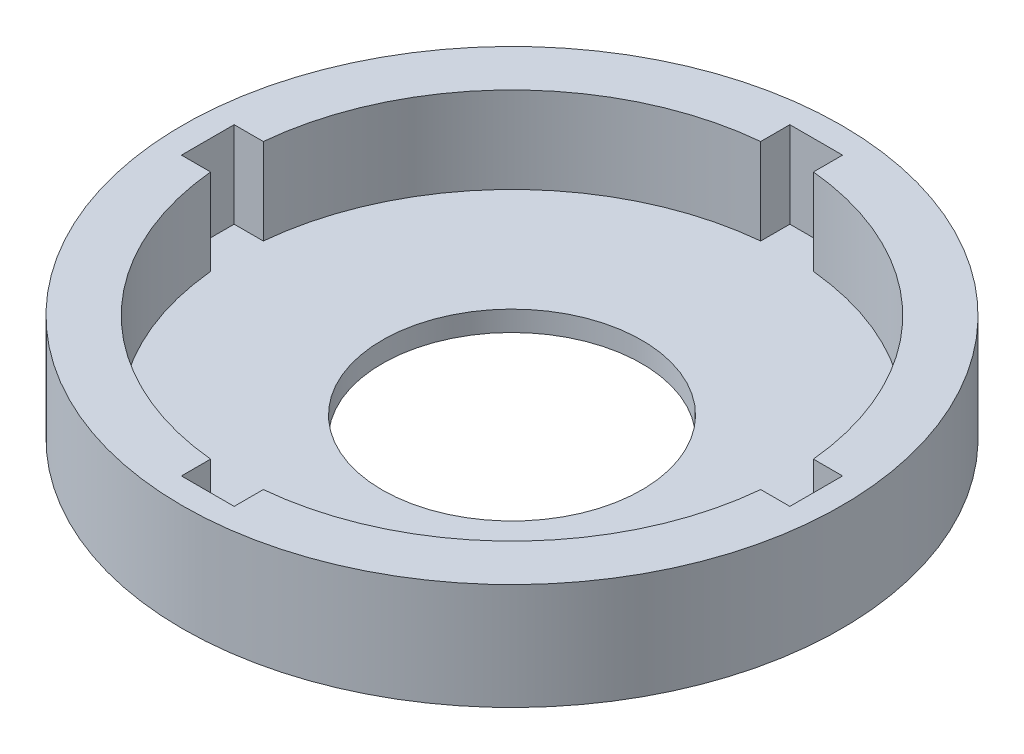
ISO-10303-21;
HEADER;
FILE_DESCRIPTION(('STEP AP214'),'2;1');
FILE_NAME('part.step','',(''),(''),'','','');
FILE_SCHEMA(('AUTOMOTIVE_DESIGN { 1 0 10303 214 1 1 1 1 }'));
ENDSEC;
DATA;
#1=APPLICATION_CONTEXT('core data for automotive mechanical design processes');
#2=APPLICATION_PROTOCOL_DEFINITION('international standard','automotive_design',2000,#1);
#3=PRODUCT_CONTEXT('',#1,'mechanical');
#4=PRODUCT('Part','Part','',(#3));
#5=PRODUCT_RELATED_PRODUCT_CATEGORY('part','',(#4));
#6=PRODUCT_DEFINITION_FORMATION('','',#4);
#7=PRODUCT_DEFINITION_CONTEXT('part definition',#1,'design');
#8=PRODUCT_DEFINITION('design','',#6,#7);
#9=PRODUCT_DEFINITION_SHAPE('','',#8);
#10=(LENGTH_UNIT() NAMED_UNIT(*) SI_UNIT(.MILLI.,.METRE.));
#11=(NAMED_UNIT(*) PLANE_ANGLE_UNIT() SI_UNIT($,.RADIAN.));
#12=(NAMED_UNIT(*) SI_UNIT($,.STERADIAN.) SOLID_ANGLE_UNIT());
#13=UNCERTAINTY_MEASURE_WITH_UNIT(LENGTH_MEASURE(1.E-05),#10,'distance_accuracy_value','');
#14=(GEOMETRIC_REPRESENTATION_CONTEXT(3) GLOBAL_UNCERTAINTY_ASSIGNED_CONTEXT((#13)) GLOBAL_UNIT_ASSIGNED_CONTEXT((#10,
#11,#12)) REPRESENTATION_CONTEXT('',''));
#15=CARTESIAN_POINT('',(0.,0.,0.));
#16=DIRECTION('',(0.,0.,1.));
#17=DIRECTION('',(1.,0.,0.));
#18=AXIS2_PLACEMENT_3D('',#15,#16,#17);
#19=CARTESIAN_POINT('',(0.,2.,0.));
#20=DIRECTION('',(0.,1.,0.));
#21=DIRECTION('',(0.,0.,1.));
#22=AXIS2_PLACEMENT_3D('',#19,#20,#21);
#23=PLANE('',#22);
#24=CARTESIAN_POINT('',(0.,2.,0.));
#25=DIRECTION('',(0.,1.,0.));
#26=DIRECTION('',(0.,0.,1.));
#27=AXIS2_PLACEMENT_3D('',#24,#25,#26);
#28=CIRCLE('',#27,27.25);
#29=CARTESIAN_POINT('',(2.6,2.,27.1256797149859));
#30=VERTEX_POINT('',#29);
#31=CARTESIAN_POINT('',(27.1256797149859,2.,2.59999999999999));
#32=VERTEX_POINT('',#31);
#33=EDGE_CURVE('E199',#30,#32,#28,.T.);
#34=ORIENTED_EDGE('',*,*,#33,.T.);
#35=DIRECTION('',(-1.,0.,0.));
#36=VECTOR('',#35,1.);
#37=CARTESIAN_POINT('',(0.,2.,2.6));
#38=LINE('',#37,#36);
#39=CARTESIAN_POINT('',(30.,2.,2.59999999999999));
#40=VERTEX_POINT('',#39);
#41=EDGE_CURVE('E244',#40,#32,#38,.T.);
#42=ORIENTED_EDGE('',*,*,#41,.F.);
#43=DIRECTION('',(0.,0.,1.));
#44=VECTOR('',#43,1.);
#45=CARTESIAN_POINT('',(30.,2.,0.));
#46=LINE('',#45,#44);
#47=CARTESIAN_POINT('',(30.,2.,-2.60000000000001));
#48=VERTEX_POINT('',#47);
#49=EDGE_CURVE('E241',#48,#40,#46,.T.);
#50=ORIENTED_EDGE('',*,*,#49,.F.);
#51=DIRECTION('',(-1.,0.,0.));
#52=VECTOR('',#51,1.);
#53=CARTESIAN_POINT('',(0.,2.,-2.6));
#54=LINE('',#53,#52);
#55=CARTESIAN_POINT('',(27.1256797149859,2.,-2.60000000000001));
#56=VERTEX_POINT('',#55);
#57=EDGE_CURVE('E168',#48,#56,#54,.T.);
#58=ORIENTED_EDGE('',*,*,#57,.T.);
#59=CARTESIAN_POINT('',(2.60000000000001,2.,-27.1256797149859));
#60=VERTEX_POINT('',#59);
#61=EDGE_CURVE('E204',#56,#60,#28,.T.);
#62=ORIENTED_EDGE('',*,*,#61,.T.);
#63=DIRECTION('',(0.,0.,1.));
#64=VECTOR('',#63,1.);
#65=CARTESIAN_POINT('',(2.60000000000001,2.,0.));
#66=LINE('',#65,#64);
#67=CARTESIAN_POINT('',(2.60000000000001,2.,-30.));
#68=VERTEX_POINT('',#67);
#69=EDGE_CURVE('E235',#68,#60,#66,.T.);
#70=ORIENTED_EDGE('',*,*,#69,.F.);
#71=DIRECTION('',(1.,0.,0.));
#72=VECTOR('',#71,1.);
#73=CARTESIAN_POINT('',(0.,2.,-30.));
#74=LINE('',#73,#72);
#75=CARTESIAN_POINT('',(-2.59999999999999,2.,-30.));
#76=VERTEX_POINT('',#75);
#77=EDGE_CURVE('E232',#76,#68,#74,.T.);
#78=ORIENTED_EDGE('',*,*,#77,.F.);
#79=DIRECTION('',(0.,0.,1.));
#80=VECTOR('',#79,1.);
#81=CARTESIAN_POINT('',(-2.59999999999999,2.,0.));
#82=LINE('',#81,#80);
#83=CARTESIAN_POINT('',(-2.59999999999999,2.,-27.1256797149859));
#84=VERTEX_POINT('',#83);
#85=EDGE_CURVE('E228',#76,#84,#82,.T.);
#86=ORIENTED_EDGE('',*,*,#85,.T.);
#87=CARTESIAN_POINT('',(-27.1256797149859,2.,-2.60000000000002));
#88=VERTEX_POINT('',#87);
#89=EDGE_CURVE('E227',#84,#88,#28,.T.);
#90=ORIENTED_EDGE('',*,*,#89,.T.);
#91=DIRECTION('',(1.,0.,0.));
#92=VECTOR('',#91,1.);
#93=CARTESIAN_POINT('',(0.,2.,-2.60000000000002));
#94=LINE('',#93,#92);
#95=CARTESIAN_POINT('',(-30.,2.,-2.60000000000002));
#96=VERTEX_POINT('',#95);
#97=EDGE_CURVE('E223',#96,#88,#94,.T.);
#98=ORIENTED_EDGE('',*,*,#97,.F.);
#99=DIRECTION('',(0.,0.,-1.));
#100=VECTOR('',#99,1.);
#101=CARTESIAN_POINT('',(-30.,2.,0.));
#102=LINE('',#101,#100);
#103=CARTESIAN_POINT('',(-30.,2.,2.59999999999998));
#104=VERTEX_POINT('',#103);
#105=EDGE_CURVE('E220',#104,#96,#102,.T.);
#106=ORIENTED_EDGE('',*,*,#105,.F.);
#107=DIRECTION('',(1.,0.,0.));
#108=VECTOR('',#107,1.);
#109=CARTESIAN_POINT('',(0.,2.,2.59999999999998));
#110=LINE('',#109,#108);
#111=CARTESIAN_POINT('',(-27.1256797149859,2.,2.59999999999998));
#112=VERTEX_POINT('',#111);
#113=EDGE_CURVE('E216',#104,#112,#110,.T.);
#114=ORIENTED_EDGE('',*,*,#113,.T.);
#115=CARTESIAN_POINT('',(-2.6,2.,27.1256797149859));
#116=VERTEX_POINT('',#115);
#117=EDGE_CURVE('E205',#112,#116,#28,.T.);
#118=ORIENTED_EDGE('',*,*,#117,.T.);
#119=DIRECTION('',(0.,0.,-1.));
#120=VECTOR('',#119,1.);
#121=CARTESIAN_POINT('',(-2.6,2.,0.));
#122=LINE('',#121,#120);
#123=CARTESIAN_POINT('',(-2.6,2.,30.));
#124=VERTEX_POINT('',#123);
#125=EDGE_CURVE('E212',#124,#116,#122,.T.);
#126=ORIENTED_EDGE('',*,*,#125,.F.);
#127=DIRECTION('',(-1.,0.,0.));
#128=VECTOR('',#127,1.);
#129=CARTESIAN_POINT('',(0.,2.,30.));
#130=LINE('',#129,#128);
#131=CARTESIAN_POINT('',(2.6,2.,30.));
#132=VERTEX_POINT('',#131);
#133=EDGE_CURVE('E209',#132,#124,#130,.T.);
#134=ORIENTED_EDGE('',*,*,#133,.F.);
#135=DIRECTION('',(0.,0.,-1.));
#136=VECTOR('',#135,1.);
#137=CARTESIAN_POINT('',(2.6,2.,0.));
#138=LINE('',#137,#136);
#139=EDGE_CURVE('E203',#132,#30,#138,.T.);
#140=ORIENTED_EDGE('',*,*,#139,.T.);
#141=EDGE_LOOP('',(#34,#42,#50,#58,#62,#70,#78,#86,#90,#98,#106,#114,#118,#126,#134,#140));
#142=FACE_BOUND('',#141,.T.);
#143=CARTESIAN_POINT('',(0.,2.,0.));
#144=DIRECTION('',(0.,1.,0.));
#145=DIRECTION('',(0.,0.,1.));
#146=AXIS2_PLACEMENT_3D('',#143,#144,#145);
#147=CIRCLE('',#146,12.8);
#148=CARTESIAN_POINT('',(0.,2.,12.8));
#149=VERTEX_POINT('',#148);
#150=EDGE_CURVE('E50',#149,#149,#147,.T.);
#151=ORIENTED_EDGE('',*,*,#150,.F.);
#152=EDGE_LOOP('',(#151));
#153=FACE_BOUND('',#152,.T.);
#154=ADVANCED_FACE('F41',(#142,#153),#23,.T.);
#155=CARTESIAN_POINT('',(0.,0.,0.));
#156=DIRECTION('',(0.,1.,0.));
#157=DIRECTION('',(0.,0.,1.));
#158=AXIS2_PLACEMENT_3D('',#155,#156,#157);
#159=PLANE('',#158);
#160=CARTESIAN_POINT('',(0.,0.,0.));
#161=DIRECTION('',(0.,1.,0.));
#162=DIRECTION('',(0.,0.,1.));
#163=AXIS2_PLACEMENT_3D('',#160,#161,#162);
#164=CIRCLE('',#163,32.5);
#165=CARTESIAN_POINT('',(0.,0.,32.5));
#166=VERTEX_POINT('',#165);
#167=EDGE_CURVE('E11',#166,#166,#164,.T.);
#168=ORIENTED_EDGE('',*,*,#167,.F.);
#169=EDGE_LOOP('',(#168));
#170=FACE_BOUND('',#169,.T.);
#171=CARTESIAN_POINT('',(0.,0.,0.));
#172=DIRECTION('',(0.,1.,0.));
#173=DIRECTION('',(0.,0.,1.));
#174=AXIS2_PLACEMENT_3D('',#171,#172,#173);
#175=CIRCLE('',#174,12.8);
#176=CARTESIAN_POINT('',(0.,0.,12.8));
#177=VERTEX_POINT('',#176);
#178=EDGE_CURVE('E291',#177,#177,#175,.T.);
#179=ORIENTED_EDGE('',*,*,#178,.T.);
#180=EDGE_LOOP('',(#179));
#181=FACE_BOUND('',#180,.T.);
#182=ADVANCED_FACE('F298',(#170,#181),#159,.F.);
#183=CARTESIAN_POINT('',(0.,2.,0.));
#184=DIRECTION('',(0.,-1.,0.));
#185=DIRECTION('',(0.,0.,-1.));
#186=AXIS2_PLACEMENT_3D('',#183,#184,#185);
#187=CYLINDRICAL_SURFACE('',#186,32.5);
#188=ORIENTED_EDGE('',*,*,#167,.T.);
#189=EDGE_LOOP('',(#188));
#190=FACE_BOUND('',#189,.T.);
#191=CARTESIAN_POINT('',(0.,10.5,0.));
#192=DIRECTION('',(0.,1.,0.));
#193=DIRECTION('',(0.,0.,1.));
#194=AXIS2_PLACEMENT_3D('',#191,#192,#193);
#195=CIRCLE('',#194,32.5);
#196=CARTESIAN_POINT('',(0.,10.5,32.5));
#197=VERTEX_POINT('',#196);
#198=EDGE_CURVE('E195',#197,#197,#195,.T.);
#199=ORIENTED_EDGE('',*,*,#198,.F.);
#200=EDGE_LOOP('',(#199));
#201=FACE_BOUND('',#200,.T.);
#202=ADVANCED_FACE('F43',(#190,#201),#187,.T.);
#203=CARTESIAN_POINT('',(0.,2.,0.));
#204=DIRECTION('',(0.,-1.,0.));
#205=DIRECTION('',(0.,0.,-1.));
#206=AXIS2_PLACEMENT_3D('',#203,#204,#205);
#207=CYLINDRICAL_SURFACE('',#206,12.8);
#208=ORIENTED_EDGE('',*,*,#150,.T.);
#209=EDGE_LOOP('',(#208));
#210=FACE_BOUND('',#209,.T.);
#211=ORIENTED_EDGE('',*,*,#178,.F.);
#212=EDGE_LOOP('',(#211));
#213=FACE_BOUND('',#212,.T.);
#214=ADVANCED_FACE('F300',(#210,#213),#207,.F.);
#215=CARTESIAN_POINT('',(0.,10.5,0.));
#216=DIRECTION('',(0.,-1.,0.));
#217=DIRECTION('',(0.,0.,-1.));
#218=AXIS2_PLACEMENT_3D('',#215,#216,#217);
#219=CYLINDRICAL_SURFACE('',#218,27.25);
#220=ORIENTED_EDGE('',*,*,#33,.F.);
#221=DIRECTION('',(0.,-1.,0.));
#222=VECTOR('',#221,1.);
#223=CARTESIAN_POINT('',(2.6,10.5,27.1256797149859));
#224=LINE('',#223,#222);
#225=CARTESIAN_POINT('',(2.6,10.5,27.1256797149859));
#226=VERTEX_POINT('',#225);
#227=EDGE_CURVE('E122',#226,#30,#224,.T.);
#228=ORIENTED_EDGE('',*,*,#227,.F.);
#229=CARTESIAN_POINT('',(0.,10.5,0.));
#230=DIRECTION('',(0.,1.,0.));
#231=DIRECTION('',(0.,0.,1.));
#232=AXIS2_PLACEMENT_3D('',#229,#230,#231);
#233=CIRCLE('',#232,27.25);
#234=CARTESIAN_POINT('',(27.1256797149859,10.5,2.59999999999999));
#235=VERTEX_POINT('',#234);
#236=EDGE_CURVE('E189',#226,#235,#233,.T.);
#237=ORIENTED_EDGE('',*,*,#236,.T.);
#238=DIRECTION('',(0.,-1.,0.));
#239=VECTOR('',#238,1.);
#240=CARTESIAN_POINT('',(27.1256797149859,10.5,2.59999999999999));
#241=LINE('',#240,#239);
#242=EDGE_CURVE('E118',#235,#32,#241,.T.);
#243=ORIENTED_EDGE('',*,*,#242,.T.);
#244=EDGE_LOOP('',(#220,#228,#237,#243));
#245=FACE_BOUND('',#244,.T.);
#246=ADVANCED_FACE('F302',(#245),#219,.F.);
#247=CARTESIAN_POINT('',(2.6,10.5,0.));
#248=DIRECTION('',(-1.,0.,0.));
#249=DIRECTION('',(0.,0.,1.));
#250=AXIS2_PLACEMENT_3D('',#247,#248,#249);
#251=PLANE('',#250);
#252=ORIENTED_EDGE('',*,*,#139,.F.);
#253=DIRECTION('',(0.,-1.,0.));
#254=VECTOR('',#253,1.);
#255=CARTESIAN_POINT('',(2.6,10.5,30.));
#256=LINE('',#255,#254);
#257=CARTESIAN_POINT('',(2.6,10.5,30.));
#258=VERTEX_POINT('',#257);
#259=EDGE_CURVE('E286',#258,#132,#256,.T.);
#260=ORIENTED_EDGE('',*,*,#259,.F.);
#261=DIRECTION('',(0.,0.,-1.));
#262=VECTOR('',#261,1.);
#263=CARTESIAN_POINT('',(2.6,10.5,0.));
#264=LINE('',#263,#262);
#265=EDGE_CURVE('E332',#258,#226,#264,.T.);
#266=ORIENTED_EDGE('',*,*,#265,.T.);
#267=ORIENTED_EDGE('',*,*,#227,.T.);
#268=EDGE_LOOP('',(#252,#260,#266,#267));
#269=FACE_BOUND('',#268,.T.);
#270=ADVANCED_FACE('F309',(#269),#251,.T.);
#271=CARTESIAN_POINT('',(0.,10.5,30.));
#272=DIRECTION('',(0.,0.,1.));
#273=DIRECTION('',(1.,0.,0.));
#274=AXIS2_PLACEMENT_3D('',#271,#272,#273);
#275=PLANE('',#274);
#276=ORIENTED_EDGE('',*,*,#133,.T.);
#277=DIRECTION('',(0.,-1.,0.));
#278=VECTOR('',#277,1.);
#279=CARTESIAN_POINT('',(-2.6,10.5,30.));
#280=LINE('',#279,#278);
#281=CARTESIAN_POINT('',(-2.6,10.5,30.));
#282=VERTEX_POINT('',#281);
#283=EDGE_CURVE('E282',#282,#124,#280,.T.);
#284=ORIENTED_EDGE('',*,*,#283,.F.);
#285=DIRECTION('',(-1.,0.,0.));
#286=VECTOR('',#285,1.);
#287=CARTESIAN_POINT('',(0.,10.5,30.));
#288=LINE('',#287,#286);
#289=EDGE_CURVE('E334',#258,#282,#288,.T.);
#290=ORIENTED_EDGE('',*,*,#289,.F.);
#291=ORIENTED_EDGE('',*,*,#259,.T.);
#292=EDGE_LOOP('',(#276,#284,#290,#291));
#293=FACE_BOUND('',#292,.T.);
#294=ADVANCED_FACE('F390',(#293),#275,.F.);
#295=CARTESIAN_POINT('',(-2.6,10.5,0.));
#296=DIRECTION('',(-1.,0.,0.));
#297=DIRECTION('',(0.,0.,1.));
#298=AXIS2_PLACEMENT_3D('',#295,#296,#297);
#299=PLANE('',#298);
#300=ORIENTED_EDGE('',*,*,#125,.T.);
#301=DIRECTION('',(0.,-1.,0.));
#302=VECTOR('',#301,1.);
#303=CARTESIAN_POINT('',(-2.6,10.5,27.1256797149859));
#304=LINE('',#303,#302);
#305=CARTESIAN_POINT('',(-2.6,10.5,27.1256797149859));
#306=VERTEX_POINT('',#305);
#307=EDGE_CURVE('E279',#306,#116,#304,.T.);
#308=ORIENTED_EDGE('',*,*,#307,.F.);
#309=DIRECTION('',(0.,0.,-1.));
#310=VECTOR('',#309,1.);
#311=CARTESIAN_POINT('',(-2.6,10.5,0.));
#312=LINE('',#311,#310);
#313=EDGE_CURVE('E338',#282,#306,#312,.T.);
#314=ORIENTED_EDGE('',*,*,#313,.F.);
#315=ORIENTED_EDGE('',*,*,#283,.T.);
#316=EDGE_LOOP('',(#300,#308,#314,#315));
#317=FACE_BOUND('',#316,.T.);
#318=ADVANCED_FACE('F387',(#317),#299,.F.);
#319=ORIENTED_EDGE('',*,*,#117,.F.);
#320=DIRECTION('',(0.,-1.,0.));
#321=VECTOR('',#320,1.);
#322=CARTESIAN_POINT('',(-27.1256797149859,10.5,2.59999999999998));
#323=LINE('',#322,#321);
#324=CARTESIAN_POINT('',(-27.1256797149859,10.5,2.59999999999998));
#325=VERTEX_POINT('',#324);
#326=EDGE_CURVE('E276',#325,#112,#323,.T.);
#327=ORIENTED_EDGE('',*,*,#326,.F.);
#328=EDGE_CURVE('E340',#325,#306,#233,.T.);
#329=ORIENTED_EDGE('',*,*,#328,.T.);
#330=ORIENTED_EDGE('',*,*,#307,.T.);
#331=EDGE_LOOP('',(#319,#327,#329,#330));
#332=FACE_BOUND('',#331,.T.);
#333=ADVANCED_FACE('F311',(#332),#219,.F.);
#334=CARTESIAN_POINT('',(0.,10.5,2.59999999999998));
#335=DIRECTION('',(0.,0.,-1.));
#336=DIRECTION('',(-1.,0.,0.));
#337=AXIS2_PLACEMENT_3D('',#334,#335,#336);
#338=PLANE('',#337);
#339=ORIENTED_EDGE('',*,*,#113,.F.);
#340=DIRECTION('',(0.,-1.,0.));
#341=VECTOR('',#340,1.);
#342=CARTESIAN_POINT('',(-30.,10.5,2.59999999999998));
#343=LINE('',#342,#341);
#344=CARTESIAN_POINT('',(-30.,10.5,2.59999999999998));
#345=VERTEX_POINT('',#344);
#346=EDGE_CURVE('E273',#345,#104,#343,.T.);
#347=ORIENTED_EDGE('',*,*,#346,.F.);
#348=DIRECTION('',(1.,0.,0.));
#349=VECTOR('',#348,1.);
#350=CARTESIAN_POINT('',(0.,10.5,2.59999999999998));
#351=LINE('',#350,#349);
#352=EDGE_CURVE('E344',#345,#325,#351,.T.);
#353=ORIENTED_EDGE('',*,*,#352,.T.);
#354=ORIENTED_EDGE('',*,*,#326,.T.);
#355=EDGE_LOOP('',(#339,#347,#353,#354));
#356=FACE_BOUND('',#355,.T.);
#357=ADVANCED_FACE('F394',(#356),#338,.T.);
#358=CARTESIAN_POINT('',(-30.,10.5,0.));
#359=DIRECTION('',(-1.,0.,0.));
#360=DIRECTION('',(0.,0.,1.));
#361=AXIS2_PLACEMENT_3D('',#358,#359,#360);
#362=PLANE('',#361);
#363=ORIENTED_EDGE('',*,*,#105,.T.);
#364=DIRECTION('',(0.,-1.,0.));
#365=VECTOR('',#364,1.);
#366=CARTESIAN_POINT('',(-30.,10.5,-2.60000000000002));
#367=LINE('',#366,#365);
#368=CARTESIAN_POINT('',(-30.,10.5,-2.60000000000002));
#369=VERTEX_POINT('',#368);
#370=EDGE_CURVE('E269',#369,#96,#367,.T.);
#371=ORIENTED_EDGE('',*,*,#370,.F.);
#372=DIRECTION('',(0.,0.,-1.));
#373=VECTOR('',#372,1.);
#374=CARTESIAN_POINT('',(-30.,10.5,0.));
#375=LINE('',#374,#373);
#376=EDGE_CURVE('E348',#345,#369,#375,.T.);
#377=ORIENTED_EDGE('',*,*,#376,.F.);
#378=ORIENTED_EDGE('',*,*,#346,.T.);
#379=EDGE_LOOP('',(#363,#371,#377,#378));
#380=FACE_BOUND('',#379,.T.);
#381=ADVANCED_FACE('F398',(#380),#362,.F.);
#382=CARTESIAN_POINT('',(0.,10.5,-2.60000000000002));
#383=DIRECTION('',(0.,0.,-1.));
#384=DIRECTION('',(-1.,0.,0.));
#385=AXIS2_PLACEMENT_3D('',#382,#383,#384);
#386=PLANE('',#385);
#387=ORIENTED_EDGE('',*,*,#97,.T.);
#388=DIRECTION('',(0.,-1.,0.));
#389=VECTOR('',#388,1.);
#390=CARTESIAN_POINT('',(-27.1256797149859,10.5,-2.60000000000002));
#391=LINE('',#390,#389);
#392=CARTESIAN_POINT('',(-27.1256797149859,10.5,-2.60000000000002));
#393=VERTEX_POINT('',#392);
#394=EDGE_CURVE('E266',#393,#88,#391,.T.);
#395=ORIENTED_EDGE('',*,*,#394,.F.);
#396=DIRECTION('',(1.,0.,0.));
#397=VECTOR('',#396,1.);
#398=CARTESIAN_POINT('',(0.,10.5,-2.60000000000002));
#399=LINE('',#398,#397);
#400=EDGE_CURVE('E351',#369,#393,#399,.T.);
#401=ORIENTED_EDGE('',*,*,#400,.F.);
#402=ORIENTED_EDGE('',*,*,#370,.T.);
#403=EDGE_LOOP('',(#387,#395,#401,#402));
#404=FACE_BOUND('',#403,.T.);
#405=ADVANCED_FACE('F404',(#404),#386,.F.);
#406=ORIENTED_EDGE('',*,*,#89,.F.);
#407=DIRECTION('',(0.,-1.,0.));
#408=VECTOR('',#407,1.);
#409=CARTESIAN_POINT('',(-2.59999999999999,10.5,-27.1256797149859));
#410=LINE('',#409,#408);
#411=CARTESIAN_POINT('',(-2.59999999999999,10.5,-27.1256797149859));
#412=VERTEX_POINT('',#411);
#413=EDGE_CURVE('E263',#412,#84,#410,.T.);
#414=ORIENTED_EDGE('',*,*,#413,.F.);
#415=EDGE_CURVE('E188',#412,#393,#233,.T.);
#416=ORIENTED_EDGE('',*,*,#415,.T.);
#417=ORIENTED_EDGE('',*,*,#394,.T.);
#418=EDGE_LOOP('',(#406,#414,#416,#417));
#419=FACE_BOUND('',#418,.T.);
#420=ADVANCED_FACE('F406',(#419),#219,.F.);
#421=CARTESIAN_POINT('',(-2.59999999999999,10.5,0.));
#422=DIRECTION('',(1.,0.,0.));
#423=DIRECTION('',(0.,0.,-1.));
#424=AXIS2_PLACEMENT_3D('',#421,#422,#423);
#425=PLANE('',#424);
#426=ORIENTED_EDGE('',*,*,#85,.F.);
#427=DIRECTION('',(0.,-1.,0.));
#428=VECTOR('',#427,1.);
#429=CARTESIAN_POINT('',(-2.59999999999999,10.5,-30.));
#430=LINE('',#429,#428);
#431=CARTESIAN_POINT('',(-2.59999999999999,10.5,-30.));
#432=VERTEX_POINT('',#431);
#433=EDGE_CURVE('E260',#432,#76,#430,.T.);
#434=ORIENTED_EDGE('',*,*,#433,.F.);
#435=DIRECTION('',(0.,0.,1.));
#436=VECTOR('',#435,1.);
#437=CARTESIAN_POINT('',(-2.59999999999999,10.5,0.));
#438=LINE('',#437,#436);
#439=EDGE_CURVE('E354',#432,#412,#438,.T.);
#440=ORIENTED_EDGE('',*,*,#439,.T.);
#441=ORIENTED_EDGE('',*,*,#413,.T.);
#442=EDGE_LOOP('',(#426,#434,#440,#441));
#443=FACE_BOUND('',#442,.T.);
#444=ADVANCED_FACE('F410',(#443),#425,.T.);
#445=CARTESIAN_POINT('',(0.,10.5,-30.));
#446=DIRECTION('',(0.,0.,-1.));
#447=DIRECTION('',(-1.,0.,0.));
#448=AXIS2_PLACEMENT_3D('',#445,#446,#447);
#449=PLANE('',#448);
#450=ORIENTED_EDGE('',*,*,#77,.T.);
#451=DIRECTION('',(0.,-1.,0.));
#452=VECTOR('',#451,1.);
#453=CARTESIAN_POINT('',(2.60000000000001,10.5,-30.));
#454=LINE('',#453,#452);
#455=CARTESIAN_POINT('',(2.60000000000001,10.5,-30.));
#456=VERTEX_POINT('',#455);
#457=EDGE_CURVE('E256',#456,#68,#454,.T.);
#458=ORIENTED_EDGE('',*,*,#457,.F.);
#459=DIRECTION('',(1.,0.,0.));
#460=VECTOR('',#459,1.);
#461=CARTESIAN_POINT('',(0.,10.5,-30.));
#462=LINE('',#461,#460);
#463=EDGE_CURVE('E357',#432,#456,#462,.T.);
#464=ORIENTED_EDGE('',*,*,#463,.F.);
#465=ORIENTED_EDGE('',*,*,#433,.T.);
#466=EDGE_LOOP('',(#450,#458,#464,#465));
#467=FACE_BOUND('',#466,.T.);
#468=ADVANCED_FACE('F413',(#467),#449,.F.);
#469=CARTESIAN_POINT('',(2.60000000000001,10.5,0.));
#470=DIRECTION('',(1.,0.,0.));
#471=DIRECTION('',(0.,0.,-1.));
#472=AXIS2_PLACEMENT_3D('',#469,#470,#471);
#473=PLANE('',#472);
#474=ORIENTED_EDGE('',*,*,#69,.T.);
#475=DIRECTION('',(0.,-1.,0.));
#476=VECTOR('',#475,1.);
#477=CARTESIAN_POINT('',(2.60000000000001,10.5,-27.1256797149859));
#478=LINE('',#477,#476);
#479=CARTESIAN_POINT('',(2.60000000000001,10.5,-27.1256797149859));
#480=VERTEX_POINT('',#479);
#481=EDGE_CURVE('E253',#480,#60,#478,.T.);
#482=ORIENTED_EDGE('',*,*,#481,.F.);
#483=DIRECTION('',(0.,0.,1.));
#484=VECTOR('',#483,1.);
#485=CARTESIAN_POINT('',(2.60000000000001,10.5,0.));
#486=LINE('',#485,#484);
#487=EDGE_CURVE('E186',#456,#480,#486,.T.);
#488=ORIENTED_EDGE('',*,*,#487,.F.);
#489=ORIENTED_EDGE('',*,*,#457,.T.);
#490=EDGE_LOOP('',(#474,#482,#488,#489));
#491=FACE_BOUND('',#490,.T.);
#492=ADVANCED_FACE('F366',(#491),#473,.F.);
#493=ORIENTED_EDGE('',*,*,#61,.F.);
#494=DIRECTION('',(0.,-1.,0.));
#495=VECTOR('',#494,1.);
#496=CARTESIAN_POINT('',(27.1256797149859,10.5,-2.60000000000001));
#497=LINE('',#496,#495);
#498=CARTESIAN_POINT('',(27.1256797149859,10.5,-2.60000000000001));
#499=VERTEX_POINT('',#498);
#500=EDGE_CURVE('E172',#499,#56,#497,.T.);
#501=ORIENTED_EDGE('',*,*,#500,.F.);
#502=EDGE_CURVE('E182',#499,#480,#233,.T.);
#503=ORIENTED_EDGE('',*,*,#502,.T.);
#504=ORIENTED_EDGE('',*,*,#481,.T.);
#505=EDGE_LOOP('',(#493,#501,#503,#504));
#506=FACE_BOUND('',#505,.T.);
#507=ADVANCED_FACE('F312',(#506),#219,.F.);
#508=CARTESIAN_POINT('',(0.,10.5,-2.6));
#509=DIRECTION('',(0.,0.,1.));
#510=DIRECTION('',(1.,0.,0.));
#511=AXIS2_PLACEMENT_3D('',#508,#509,#510);
#512=PLANE('',#511);
#513=ORIENTED_EDGE('',*,*,#57,.F.);
#514=DIRECTION('',(0.,-1.,0.));
#515=VECTOR('',#514,1.);
#516=CARTESIAN_POINT('',(30.,10.5,-2.60000000000001));
#517=LINE('',#516,#515);
#518=CARTESIAN_POINT('',(30.,10.5,-2.60000000000001));
#519=VERTEX_POINT('',#518);
#520=EDGE_CURVE('E162',#519,#48,#517,.T.);
#521=ORIENTED_EDGE('',*,*,#520,.F.);
#522=DIRECTION('',(-1.,0.,0.));
#523=VECTOR('',#522,1.);
#524=CARTESIAN_POINT('',(0.,10.5,-2.6));
#525=LINE('',#524,#523);
#526=EDGE_CURVE('E166',#519,#499,#525,.T.);
#527=ORIENTED_EDGE('',*,*,#526,.T.);
#528=ORIENTED_EDGE('',*,*,#500,.T.);
#529=EDGE_LOOP('',(#513,#521,#527,#528));
#530=FACE_BOUND('',#529,.T.);
#531=ADVANCED_FACE('F164',(#530),#512,.T.);
#532=CARTESIAN_POINT('',(30.,10.5,0.));
#533=DIRECTION('',(1.,0.,0.));
#534=DIRECTION('',(0.,0.,-1.));
#535=AXIS2_PLACEMENT_3D('',#532,#533,#534);
#536=PLANE('',#535);
#537=ORIENTED_EDGE('',*,*,#49,.T.);
#538=DIRECTION('',(0.,-1.,0.));
#539=VECTOR('',#538,1.);
#540=CARTESIAN_POINT('',(30.,10.5,2.59999999999999));
#541=LINE('',#540,#539);
#542=CARTESIAN_POINT('',(30.,10.5,2.59999999999999));
#543=VERTEX_POINT('',#542);
#544=EDGE_CURVE('E57',#543,#40,#541,.T.);
#545=ORIENTED_EDGE('',*,*,#544,.F.);
#546=DIRECTION('',(0.,0.,1.));
#547=VECTOR('',#546,1.);
#548=CARTESIAN_POINT('',(30.,10.5,0.));
#549=LINE('',#548,#547);
#550=EDGE_CURVE('E174',#519,#543,#549,.T.);
#551=ORIENTED_EDGE('',*,*,#550,.F.);
#552=ORIENTED_EDGE('',*,*,#520,.T.);
#553=EDGE_LOOP('',(#537,#545,#551,#552));
#554=FACE_BOUND('',#553,.T.);
#555=ADVANCED_FACE('F175',(#554),#536,.F.);
#556=CARTESIAN_POINT('',(0.,10.5,2.6));
#557=DIRECTION('',(0.,0.,1.));
#558=DIRECTION('',(1.,0.,0.));
#559=AXIS2_PLACEMENT_3D('',#556,#557,#558);
#560=PLANE('',#559);
#561=ORIENTED_EDGE('',*,*,#41,.T.);
#562=ORIENTED_EDGE('',*,*,#242,.F.);
#563=DIRECTION('',(-1.,0.,0.));
#564=VECTOR('',#563,1.);
#565=CARTESIAN_POINT('',(0.,10.5,2.6));
#566=LINE('',#565,#564);
#567=EDGE_CURVE('E65',#543,#235,#566,.T.);
#568=ORIENTED_EDGE('',*,*,#567,.F.);
#569=ORIENTED_EDGE('',*,*,#544,.T.);
#570=EDGE_LOOP('',(#561,#562,#568,#569));
#571=FACE_BOUND('',#570,.T.);
#572=ADVANCED_FACE('F505',(#571),#560,.F.);
#573=CARTESIAN_POINT('',(0.,10.5,0.));
#574=DIRECTION('',(0.,1.,0.));
#575=DIRECTION('',(0.,0.,1.));
#576=AXIS2_PLACEMENT_3D('',#573,#574,#575);
#577=PLANE('',#576);
#578=ORIENTED_EDGE('',*,*,#236,.F.);
#579=ORIENTED_EDGE('',*,*,#265,.F.);
#580=ORIENTED_EDGE('',*,*,#289,.T.);
#581=ORIENTED_EDGE('',*,*,#313,.T.);
#582=ORIENTED_EDGE('',*,*,#328,.F.);
#583=ORIENTED_EDGE('',*,*,#352,.F.);
#584=ORIENTED_EDGE('',*,*,#376,.T.);
#585=ORIENTED_EDGE('',*,*,#400,.T.);
#586=ORIENTED_EDGE('',*,*,#415,.F.);
#587=ORIENTED_EDGE('',*,*,#439,.F.);
#588=ORIENTED_EDGE('',*,*,#463,.T.);
#589=ORIENTED_EDGE('',*,*,#487,.T.);
#590=ORIENTED_EDGE('',*,*,#502,.F.);
#591=ORIENTED_EDGE('',*,*,#526,.F.);
#592=ORIENTED_EDGE('',*,*,#550,.T.);
#593=ORIENTED_EDGE('',*,*,#567,.T.);
#594=EDGE_LOOP('',(#578,#579,#580,#581,#582,#583,#584,#585,#586,#587,#588,#589,#590,#591,#592,#593));
#595=FACE_BOUND('',#594,.T.);
#596=ORIENTED_EDGE('',*,*,#198,.T.);
#597=EDGE_LOOP('',(#596));
#598=FACE_BOUND('',#597,.T.);
#599=ADVANCED_FACE('F179',(#595,#598),#577,.T.);
#600=CLOSED_SHELL('',(#154,#182,#202,#214,#246,#270,#294,#318,#333,#357,#381,#405,#420,#444,
#468,#492,#507,#531,#555,#572,#599));
#601=MANIFOLD_SOLID_BREP('B2',#600);
#602=ADVANCED_BREP_SHAPE_REPRESENTATION('',(#18,#601),#14);
#603=SHAPE_DEFINITION_REPRESENTATION(#9,#602);
ENDSEC;
END-ISO-10303-21;
